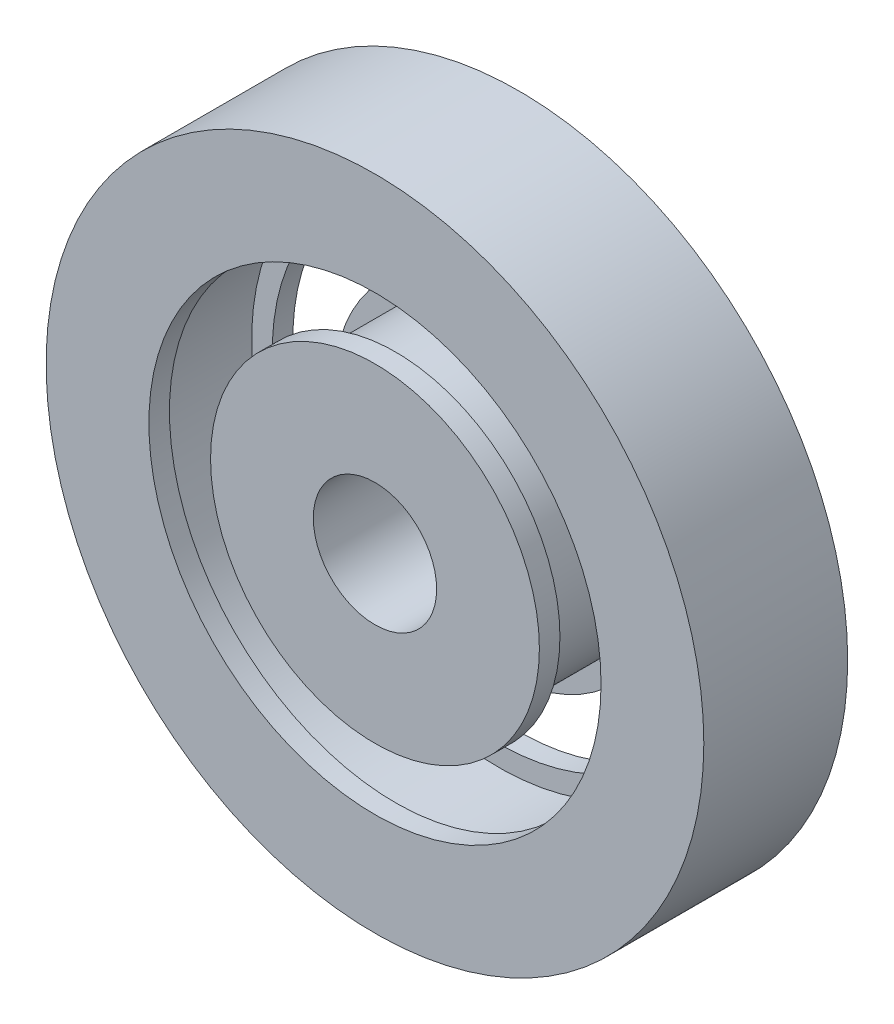
ISO-10303-21;
HEADER;
FILE_DESCRIPTION(('STEP AP214'),'2;1');
FILE_NAME('part.step','',(''),(''),'','','');
FILE_SCHEMA(('AUTOMOTIVE_DESIGN { 1 0 10303 214 1 1 1 1 }'));
ENDSEC;
DATA;
#1=APPLICATION_CONTEXT('core data for automotive mechanical design processes');
#2=APPLICATION_PROTOCOL_DEFINITION('international standard','automotive_design',2000,#1);
#3=PRODUCT_CONTEXT('',#1,'mechanical');
#4=PRODUCT('Part','Part','',(#3));
#5=PRODUCT_RELATED_PRODUCT_CATEGORY('part','',(#4));
#6=PRODUCT_DEFINITION_FORMATION('','',#4);
#7=PRODUCT_DEFINITION_CONTEXT('part definition',#1,'design');
#8=PRODUCT_DEFINITION('design','',#6,#7);
#9=PRODUCT_DEFINITION_SHAPE('','',#8);
#10=(LENGTH_UNIT() NAMED_UNIT(*) SI_UNIT(.MILLI.,.METRE.));
#11=(NAMED_UNIT(*) PLANE_ANGLE_UNIT() SI_UNIT($,.RADIAN.));
#12=(NAMED_UNIT(*) SI_UNIT($,.STERADIAN.) SOLID_ANGLE_UNIT());
#13=UNCERTAINTY_MEASURE_WITH_UNIT(LENGTH_MEASURE(1.E-05),#10,'distance_accuracy_value','');
#14=(GEOMETRIC_REPRESENTATION_CONTEXT(3) GLOBAL_UNCERTAINTY_ASSIGNED_CONTEXT((#13)) GLOBAL_UNIT_ASSIGNED_CONTEXT((#10,
#11,#12)) REPRESENTATION_CONTEXT('',''));
#15=CARTESIAN_POINT('',(0.,0.,0.));
#16=DIRECTION('',(0.,0.,1.));
#17=DIRECTION('',(1.,0.,0.));
#18=AXIS2_PLACEMENT_3D('',#15,#16,#17);
#19=CARTESIAN_POINT('',(0.,0.,2.));
#20=DIRECTION('',(0.,0.,1.));
#21=DIRECTION('',(1.,0.,0.));
#22=AXIS2_PLACEMENT_3D('',#19,#20,#21);
#23=PLANE('',#22);
#24=CARTESIAN_POINT('',(0.,0.,2.));
#25=DIRECTION('',(0.,0.,1.));
#26=DIRECTION('',(1.,0.,0.));
#27=AXIS2_PLACEMENT_3D('',#24,#25,#26);
#28=CIRCLE('',#27,14.);
#29=CARTESIAN_POINT('',(14.,0.,2.));
#30=VERTEX_POINT('',#29);
#31=EDGE_CURVE('E70',#30,#30,#28,.T.);
#32=ORIENTED_EDGE('',*,*,#31,.F.);
#33=EDGE_LOOP('',(#32));
#34=FACE_BOUND('',#33,.T.);
#35=CARTESIAN_POINT('',(0.,0.,2.));
#36=DIRECTION('',(0.,0.,1.));
#37=DIRECTION('',(1.,0.,0.));
#38=AXIS2_PLACEMENT_3D('',#35,#36,#37);
#39=CIRCLE('',#38,16.);
#40=CARTESIAN_POINT('',(16.,0.,2.));
#41=VERTEX_POINT('',#40);
#42=EDGE_CURVE('E55',#41,#41,#39,.T.);
#43=ORIENTED_EDGE('',*,*,#42,.T.);
#44=EDGE_LOOP('',(#43));
#45=FACE_BOUND('',#44,.T.);
#46=ADVANCED_FACE('F51',(#34,#45),#23,.T.);
#47=CARTESIAN_POINT('',(0.,0.,2.));
#48=DIRECTION('',(0.,0.,1.));
#49=DIRECTION('',(1.,0.,0.));
#50=AXIS2_PLACEMENT_3D('',#47,#48,#49);
#51=CYLINDRICAL_SURFACE('',#50,14.);
#52=ORIENTED_EDGE('',*,*,#31,.T.);
#53=EDGE_LOOP('',(#52));
#54=FACE_BOUND('',#53,.T.);
#55=CARTESIAN_POINT('',(0.,0.,12.));
#56=DIRECTION('',(0.,0.,1.));
#57=DIRECTION('',(1.,0.,0.));
#58=AXIS2_PLACEMENT_3D('',#55,#56,#57);
#59=CIRCLE('',#58,14.);
#60=CARTESIAN_POINT('',(14.,0.,12.));
#61=VERTEX_POINT('',#60);
#62=EDGE_CURVE('E64',#61,#61,#59,.T.);
#63=ORIENTED_EDGE('',*,*,#62,.F.);
#64=EDGE_LOOP('',(#63));
#65=FACE_BOUND('',#64,.T.);
#66=ADVANCED_FACE('F81',(#54,#65),#51,.T.);
#67=CARTESIAN_POINT('',(0.,0.,12.));
#68=DIRECTION('',(0.,0.,1.));
#69=DIRECTION('',(1.,0.,0.));
#70=AXIS2_PLACEMENT_3D('',#67,#68,#69);
#71=CYLINDRICAL_SURFACE('',#70,16.);
#72=CARTESIAN_POINT('',(0.,0.,12.));
#73=DIRECTION('',(0.,0.,1.));
#74=DIRECTION('',(1.,0.,0.));
#75=AXIS2_PLACEMENT_3D('',#72,#73,#74);
#76=CIRCLE('',#75,16.);
#77=CARTESIAN_POINT('',(16.,0.,12.));
#78=VERTEX_POINT('',#77);
#79=EDGE_CURVE('E72',#78,#78,#76,.T.);
#80=ORIENTED_EDGE('',*,*,#79,.T.);
#81=EDGE_LOOP('',(#80));
#82=FACE_BOUND('',#81,.T.);
#83=CARTESIAN_POINT('',(0.,0.,14.));
#84=DIRECTION('',(0.,0.,1.));
#85=DIRECTION('',(1.,0.,0.));
#86=AXIS2_PLACEMENT_3D('',#83,#84,#85);
#87=CIRCLE('',#86,16.);
#88=CARTESIAN_POINT('',(16.,0.,14.));
#89=VERTEX_POINT('',#88);
#90=EDGE_CURVE('E59',#89,#89,#87,.T.);
#91=ORIENTED_EDGE('',*,*,#90,.F.);
#92=EDGE_LOOP('',(#91));
#93=FACE_BOUND('',#92,.T.);
#94=ADVANCED_FACE('F83',(#82,#93),#71,.T.);
#95=CARTESIAN_POINT('',(0.,0.,12.));
#96=DIRECTION('',(0.,0.,1.));
#97=DIRECTION('',(1.,0.,0.));
#98=AXIS2_PLACEMENT_3D('',#95,#96,#97);
#99=PLANE('',#98);
#100=ORIENTED_EDGE('',*,*,#62,.T.);
#101=EDGE_LOOP('',(#100));
#102=FACE_BOUND('',#101,.T.);
#103=ORIENTED_EDGE('',*,*,#79,.F.);
#104=EDGE_LOOP('',(#103));
#105=FACE_BOUND('',#104,.T.);
#106=ADVANCED_FACE('F78',(#102,#105),#99,.F.);
#107=CARTESIAN_POINT('',(0.,0.,14.));
#108=DIRECTION('',(0.,0.,1.));
#109=DIRECTION('',(1.,0.,0.));
#110=AXIS2_PLACEMENT_3D('',#107,#108,#109);
#111=PLANE('',#110);
#112=CARTESIAN_POINT('',(0.,0.,14.));
#113=DIRECTION('',(0.,0.,1.));
#114=DIRECTION('',(1.,0.,0.));
#115=AXIS2_PLACEMENT_3D('',#112,#113,#114);
#116=CIRCLE('',#115,6.);
#117=CARTESIAN_POINT('',(6.,0.,14.));
#118=VERTEX_POINT('',#117);
#119=EDGE_CURVE('E68',#118,#118,#116,.T.);
#120=ORIENTED_EDGE('',*,*,#119,.F.);
#121=EDGE_LOOP('',(#120));
#122=FACE_BOUND('',#121,.T.);
#123=ORIENTED_EDGE('',*,*,#90,.T.);
#124=EDGE_LOOP('',(#123));
#125=FACE_BOUND('',#124,.T.);
#126=ADVANCED_FACE('F99',(#122,#125),#111,.T.);
#127=CARTESIAN_POINT('',(0.,0.,-54.));
#128=DIRECTION('',(0.,0.,1.));
#129=DIRECTION('',(1.,0.,0.));
#130=AXIS2_PLACEMENT_3D('',#127,#128,#129);
#131=CYLINDRICAL_SURFACE('',#130,16.);
#132=ORIENTED_EDGE('',*,*,#42,.F.);
#133=EDGE_LOOP('',(#132));
#134=FACE_BOUND('',#133,.T.);
#135=CARTESIAN_POINT('',(0.,0.,0.));
#136=DIRECTION('',(0.,0.,1.));
#137=DIRECTION('',(1.,0.,0.));
#138=AXIS2_PLACEMENT_3D('',#135,#136,#137);
#139=CIRCLE('',#138,16.);
#140=CARTESIAN_POINT('',(16.,0.,0.));
#141=VERTEX_POINT('',#140);
#142=EDGE_CURVE('E11',#141,#141,#139,.T.);
#143=ORIENTED_EDGE('',*,*,#142,.T.);
#144=EDGE_LOOP('',(#143));
#145=FACE_BOUND('',#144,.T.);
#146=ADVANCED_FACE('F100',(#134,#145),#131,.T.);
#147=CARTESIAN_POINT('',(0.,0.,0.));
#148=DIRECTION('',(0.,0.,1.));
#149=DIRECTION('',(1.,0.,0.));
#150=AXIS2_PLACEMENT_3D('',#147,#148,#149);
#151=PLANE('',#150);
#152=CARTESIAN_POINT('',(0.,0.,0.));
#153=DIRECTION('',(0.,0.,-1.));
#154=DIRECTION('',(-1.,0.,0.));
#155=AXIS2_PLACEMENT_3D('',#152,#153,#154);
#156=CIRCLE('',#155,6.);
#157=CARTESIAN_POINT('',(-6.,0.,0.));
#158=VERTEX_POINT('',#157);
#159=EDGE_CURVE('E114',#158,#158,#156,.T.);
#160=ORIENTED_EDGE('',*,*,#159,.F.);
#161=EDGE_LOOP('',(#160));
#162=FACE_BOUND('',#161,.T.);
#163=ORIENTED_EDGE('',*,*,#142,.F.);
#164=EDGE_LOOP('',(#163));
#165=FACE_BOUND('',#164,.T.);
#166=ADVANCED_FACE('F53',(#162,#165),#151,.F.);
#167=CARTESIAN_POINT('',(0.,0.,68.));
#168=DIRECTION('',(0.,0.,-1.));
#169=DIRECTION('',(-1.,0.,0.));
#170=AXIS2_PLACEMENT_3D('',#167,#168,#169);
#171=CYLINDRICAL_SURFACE('',#170,6.);
#172=ORIENTED_EDGE('',*,*,#119,.T.);
#173=EDGE_LOOP('',(#172));
#174=FACE_BOUND('',#173,.T.);
#175=ORIENTED_EDGE('',*,*,#159,.T.);
#176=EDGE_LOOP('',(#175));
#177=FACE_BOUND('',#176,.T.);
#178=ADVANCED_FACE('F95',(#174,#177),#171,.F.);
#179=CLOSED_SHELL('',(#46,#66,#94,#106,#126,#146,#166,#178));
#180=MANIFOLD_SOLID_BREP('B2',#179);
#181=CARTESIAN_POINT('',(0.,0.,12.));
#182=DIRECTION('',(0.,0.,1.));
#183=DIRECTION('',(1.,0.,0.));
#184=AXIS2_PLACEMENT_3D('',#181,#182,#183);
#185=PLANE('',#184);
#186=CARTESIAN_POINT('',(0.,0.,12.));
#187=DIRECTION('',(0.,0.,1.));
#188=DIRECTION('',(1.,0.,0.));
#189=AXIS2_PLACEMENT_3D('',#186,#187,#188);
#190=CIRCLE('',#189,22.);
#191=CARTESIAN_POINT('',(22.,0.,12.));
#192=VERTEX_POINT('',#191);
#193=EDGE_CURVE('E200',#192,#192,#190,.T.);
#194=ORIENTED_EDGE('',*,*,#193,.T.);
#195=EDGE_LOOP('',(#194));
#196=FACE_BOUND('',#195,.T.);
#197=CARTESIAN_POINT('',(0.,0.,12.));
#198=DIRECTION('',(0.,0.,1.));
#199=DIRECTION('',(1.,0.,0.));
#200=AXIS2_PLACEMENT_3D('',#197,#198,#199);
#201=CIRCLE('',#200,24.);
#202=CARTESIAN_POINT('',(24.,0.,12.));
#203=VERTEX_POINT('',#202);
#204=EDGE_CURVE('E50',#203,#203,#201,.F.);
#205=ORIENTED_EDGE('',*,*,#204,.T.);
#206=EDGE_LOOP('',(#205));
#207=FACE_BOUND('',#206,.T.);
#208=ADVANCED_FACE('F176',(#196,#207),#185,.F.);
#209=CARTESIAN_POINT('',(0.,0.,2.));
#210=DIRECTION('',(0.,0.,1.));
#211=DIRECTION('',(1.,0.,0.));
#212=AXIS2_PLACEMENT_3D('',#209,#210,#211);
#213=CYLINDRICAL_SURFACE('',#212,24.);
#214=CARTESIAN_POINT('',(0.,0.,2.));
#215=DIRECTION('',(0.,0.,1.));
#216=DIRECTION('',(1.,0.,0.));
#217=AXIS2_PLACEMENT_3D('',#214,#215,#216);
#218=CIRCLE('',#217,24.);
#219=CARTESIAN_POINT('',(24.,0.,2.));
#220=VERTEX_POINT('',#219);
#221=EDGE_CURVE('E195',#220,#220,#218,.T.);
#222=ORIENTED_EDGE('',*,*,#221,.F.);
#223=EDGE_LOOP('',(#222));
#224=FACE_BOUND('',#223,.T.);
#225=ORIENTED_EDGE('',*,*,#204,.F.);
#226=EDGE_LOOP('',(#225));
#227=FACE_BOUND('',#226,.T.);
#228=ADVANCED_FACE('F229',(#224,#227),#213,.F.);
#229=CARTESIAN_POINT('',(0.,0.,2.));
#230=DIRECTION('',(0.,0.,1.));
#231=DIRECTION('',(1.,0.,0.));
#232=AXIS2_PLACEMENT_3D('',#229,#230,#231);
#233=PLANE('',#232);
#234=CARTESIAN_POINT('',(0.,0.,2.));
#235=DIRECTION('',(0.,0.,1.));
#236=DIRECTION('',(1.,0.,0.));
#237=AXIS2_PLACEMENT_3D('',#234,#235,#236);
#238=CIRCLE('',#237,22.);
#239=CARTESIAN_POINT('',(22.,0.,2.));
#240=VERTEX_POINT('',#239);
#241=EDGE_CURVE('E205',#240,#240,#238,.T.);
#242=ORIENTED_EDGE('',*,*,#241,.F.);
#243=EDGE_LOOP('',(#242));
#244=FACE_BOUND('',#243,.T.);
#245=ORIENTED_EDGE('',*,*,#221,.T.);
#246=EDGE_LOOP('',(#245));
#247=FACE_BOUND('',#246,.T.);
#248=ADVANCED_FACE('F236',(#244,#247),#233,.T.);
#249=CARTESIAN_POINT('',(0.,0.,12.));
#250=DIRECTION('',(0.,0.,1.));
#251=DIRECTION('',(1.,0.,0.));
#252=AXIS2_PLACEMENT_3D('',#249,#250,#251);
#253=CYLINDRICAL_SURFACE('',#252,22.);
#254=ORIENTED_EDGE('',*,*,#193,.F.);
#255=EDGE_LOOP('',(#254));
#256=FACE_BOUND('',#255,.T.);
#257=CARTESIAN_POINT('',(0.,0.,14.));
#258=DIRECTION('',(0.,0.,1.));
#259=DIRECTION('',(1.,0.,0.));
#260=AXIS2_PLACEMENT_3D('',#257,#258,#259);
#261=CIRCLE('',#260,22.);
#262=CARTESIAN_POINT('',(22.,0.,14.));
#263=VERTEX_POINT('',#262);
#264=EDGE_CURVE('E201',#263,#263,#261,.T.);
#265=ORIENTED_EDGE('',*,*,#264,.T.);
#266=EDGE_LOOP('',(#265));
#267=FACE_BOUND('',#266,.T.);
#268=ADVANCED_FACE('F240',(#256,#267),#253,.F.);
#269=CARTESIAN_POINT('',(0.,0.,14.));
#270=DIRECTION('',(0.,0.,1.));
#271=DIRECTION('',(1.,0.,0.));
#272=AXIS2_PLACEMENT_3D('',#269,#270,#271);
#273=PLANE('',#272);
#274=CARTESIAN_POINT('',(0.,0.,14.));
#275=DIRECTION('',(0.,0.,1.));
#276=DIRECTION('',(1.,0.,0.));
#277=AXIS2_PLACEMENT_3D('',#274,#275,#276);
#278=CIRCLE('',#277,32.);
#279=CARTESIAN_POINT('',(32.,0.,14.));
#280=VERTEX_POINT('',#279);
#281=EDGE_CURVE('E184',#280,#280,#278,.T.);
#282=ORIENTED_EDGE('',*,*,#281,.T.);
#283=EDGE_LOOP('',(#282));
#284=FACE_BOUND('',#283,.T.);
#285=ORIENTED_EDGE('',*,*,#264,.F.);
#286=EDGE_LOOP('',(#285));
#287=FACE_BOUND('',#286,.T.);
#288=ADVANCED_FACE('F244',(#284,#287),#273,.T.);
#289=CARTESIAN_POINT('',(0.,0.,14.));
#290=DIRECTION('',(0.,0.,-1.));
#291=DIRECTION('',(-1.,0.,0.));
#292=AXIS2_PLACEMENT_3D('',#289,#290,#291);
#293=CYLINDRICAL_SURFACE('',#292,32.);
#294=ORIENTED_EDGE('',*,*,#281,.F.);
#295=EDGE_LOOP('',(#294));
#296=FACE_BOUND('',#295,.T.);
#297=CARTESIAN_POINT('',(0.,0.,0.));
#298=DIRECTION('',(0.,0.,1.));
#299=DIRECTION('',(1.,0.,0.));
#300=AXIS2_PLACEMENT_3D('',#297,#298,#299);
#301=CIRCLE('',#300,32.);
#302=CARTESIAN_POINT('',(32.,0.,0.));
#303=VERTEX_POINT('',#302);
#304=EDGE_CURVE('E189',#303,#303,#301,.T.);
#305=ORIENTED_EDGE('',*,*,#304,.T.);
#306=EDGE_LOOP('',(#305));
#307=FACE_BOUND('',#306,.T.);
#308=ADVANCED_FACE('F178',(#296,#307),#293,.T.);
#309=CARTESIAN_POINT('',(0.,0.,0.));
#310=DIRECTION('',(0.,0.,1.));
#311=DIRECTION('',(1.,0.,0.));
#312=AXIS2_PLACEMENT_3D('',#309,#310,#311);
#313=PLANE('',#312);
#314=CARTESIAN_POINT('',(0.,0.,0.));
#315=DIRECTION('',(0.,0.,1.));
#316=DIRECTION('',(1.,0.,0.));
#317=AXIS2_PLACEMENT_3D('',#314,#315,#316);
#318=CIRCLE('',#317,22.);
#319=CARTESIAN_POINT('',(22.,0.,0.));
#320=VERTEX_POINT('',#319);
#321=EDGE_CURVE('E212',#320,#320,#318,.T.);
#322=ORIENTED_EDGE('',*,*,#321,.T.);
#323=EDGE_LOOP('',(#322));
#324=FACE_BOUND('',#323,.T.);
#325=ORIENTED_EDGE('',*,*,#304,.F.);
#326=EDGE_LOOP('',(#325));
#327=FACE_BOUND('',#326,.T.);
#328=ADVANCED_FACE('F217',(#324,#327),#313,.F.);
#329=CARTESIAN_POINT('',(0.,0.,-54.));
#330=DIRECTION('',(0.,0.,1.));
#331=DIRECTION('',(1.,0.,0.));
#332=AXIS2_PLACEMENT_3D('',#329,#330,#331);
#333=CYLINDRICAL_SURFACE('',#332,22.);
#334=ORIENTED_EDGE('',*,*,#241,.T.);
#335=EDGE_LOOP('',(#334));
#336=FACE_BOUND('',#335,.T.);
#337=ORIENTED_EDGE('',*,*,#321,.F.);
#338=EDGE_LOOP('',(#337));
#339=FACE_BOUND('',#338,.T.);
#340=ADVANCED_FACE('F220',(#336,#339),#333,.F.);
#341=CLOSED_SHELL('',(#208,#228,#248,#268,#288,#308,#328,#340));
#342=MANIFOLD_SOLID_BREP('B6',#341);
#343=ADVANCED_BREP_SHAPE_REPRESENTATION('',(#18,#180,#342),#14);
#344=SHAPE_DEFINITION_REPRESENTATION(#9,#343);
ENDSEC;
END-ISO-10303-21;
